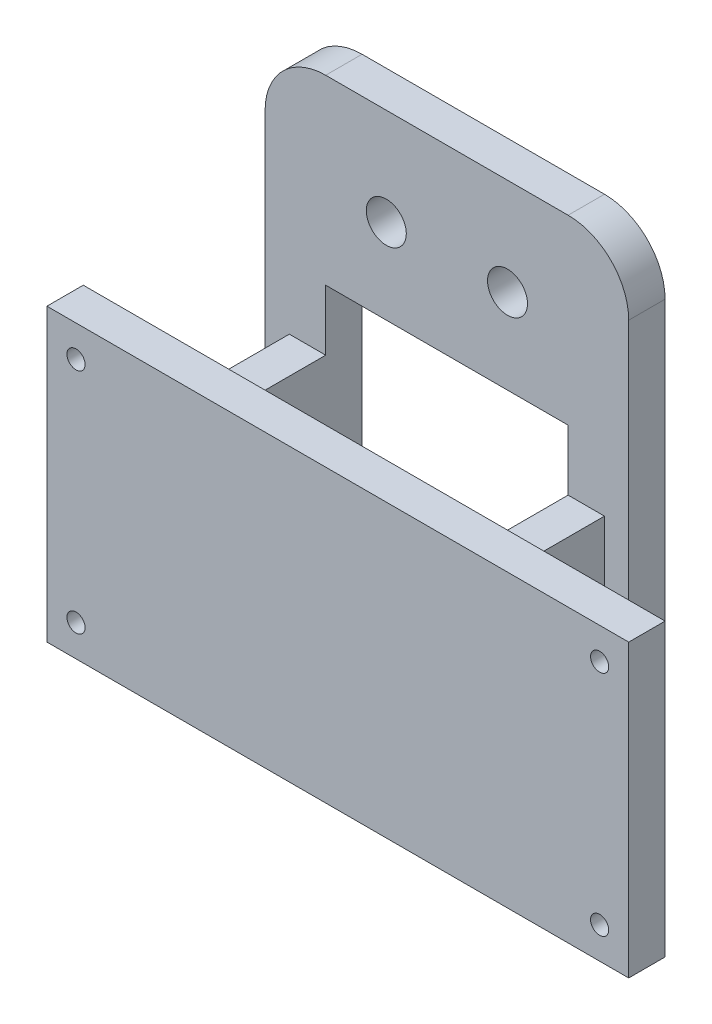
ISO-10303-21;
HEADER;
FILE_DESCRIPTION(('STEP AP214'),'2;1');
FILE_NAME('part.step','',(''),(''),'','','');
FILE_SCHEMA(('AUTOMOTIVE_DESIGN { 1 0 10303 214 1 1 1 1 }'));
ENDSEC;
DATA;
#1=APPLICATION_CONTEXT('core data for automotive mechanical design processes');
#2=APPLICATION_PROTOCOL_DEFINITION('international standard','automotive_design',2000,#1);
#3=PRODUCT_CONTEXT('',#1,'mechanical');
#4=PRODUCT('Part','Part','',(#3));
#5=PRODUCT_RELATED_PRODUCT_CATEGORY('part','',(#4));
#6=PRODUCT_DEFINITION_FORMATION('','',#4);
#7=PRODUCT_DEFINITION_CONTEXT('part definition',#1,'design');
#8=PRODUCT_DEFINITION('design','',#6,#7);
#9=PRODUCT_DEFINITION_SHAPE('','',#8);
#10=(LENGTH_UNIT() NAMED_UNIT(*) SI_UNIT(.MILLI.,.METRE.));
#11=(NAMED_UNIT(*) PLANE_ANGLE_UNIT() SI_UNIT($,.RADIAN.));
#12=(NAMED_UNIT(*) SI_UNIT($,.STERADIAN.) SOLID_ANGLE_UNIT());
#13=UNCERTAINTY_MEASURE_WITH_UNIT(LENGTH_MEASURE(1.E-05),#10,'distance_accuracy_value','');
#14=(GEOMETRIC_REPRESENTATION_CONTEXT(3) GLOBAL_UNCERTAINTY_ASSIGNED_CONTEXT((#13)) GLOBAL_UNIT_ASSIGNED_CONTEXT((#10,
#11,#12)) REPRESENTATION_CONTEXT('',''));
#15=CARTESIAN_POINT('',(0.,0.,0.));
#16=DIRECTION('',(0.,0.,1.));
#17=DIRECTION('',(1.,0.,0.));
#18=AXIS2_PLACEMENT_3D('',#15,#16,#17);
#19=CARTESIAN_POINT('',(-9.18461538461539,-30.6461538461539,3.));
#20=DIRECTION('',(0.,1.,0.));
#21=DIRECTION('',(0.,0.,1.));
#22=AXIS2_PLACEMENT_3D('',#19,#20,#21);
#23=PLANE('',#22);
#24=DIRECTION('',(1.,0.,0.));
#25=VECTOR('',#24,1.);
#26=CARTESIAN_POINT('',(-9.18461538461539,-30.6461538461539,0.));
#27=LINE('',#26,#25);
#28=CARTESIAN_POINT('',(-9.18461538461539,-30.6461538461539,0.));
#29=VERTEX_POINT('',#28);
#30=CARTESIAN_POINT('',(-4.18461538461539,-30.6461538461539,0.));
#31=VERTEX_POINT('',#30);
#32=EDGE_CURVE('E317',#29,#31,#27,.T.);
#33=ORIENTED_EDGE('',*,*,#32,.T.);
#34=DIRECTION('',(0.,0.,1.));
#35=VECTOR('',#34,1.);
#36=CARTESIAN_POINT('',(-4.18461538461539,-30.6461538461539,3.));
#37=LINE('',#36,#35);
#38=CARTESIAN_POINT('',(-4.18461538461539,-30.6461538461539,9.));
#39=VERTEX_POINT('',#38);
#40=EDGE_CURVE('E47',#31,#39,#37,.T.);
#41=ORIENTED_EDGE('',*,*,#40,.T.);
#42=DIRECTION('',(1.,0.,0.));
#43=VECTOR('',#42,1.);
#44=CARTESIAN_POINT('',(-4.18461538461539,-30.6461538461539,9.));
#45=LINE('',#44,#43);
#46=CARTESIAN_POINT('',(-7.18461538461539,-30.6461538461539,9.));
#47=VERTEX_POINT('',#46);
#48=EDGE_CURVE('E219',#47,#39,#45,.T.);
#49=ORIENTED_EDGE('',*,*,#48,.F.);
#50=DIRECTION('',(0.,0.,-1.));
#51=VECTOR('',#50,1.);
#52=CARTESIAN_POINT('',(-7.18461538461539,-30.6461538461539,9.));
#53=LINE('',#52,#51);
#54=CARTESIAN_POINT('',(-7.18461538461539,-30.6461538461539,3.));
#55=VERTEX_POINT('',#54);
#56=EDGE_CURVE('E222',#47,#55,#53,.T.);
#57=ORIENTED_EDGE('',*,*,#56,.T.);
#58=DIRECTION('',(1.,0.,0.));
#59=VECTOR('',#58,1.);
#60=CARTESIAN_POINT('',(-9.18461538461539,-30.6461538461539,3.));
#61=LINE('',#60,#59);
#62=CARTESIAN_POINT('',(-9.18461538461539,-30.6461538461539,3.));
#63=VERTEX_POINT('',#62);
#64=EDGE_CURVE('E306',#63,#55,#61,.T.);
#65=ORIENTED_EDGE('',*,*,#64,.F.);
#66=DIRECTION('',(0.,0.,-1.));
#67=VECTOR('',#66,1.);
#68=CARTESIAN_POINT('',(-9.18461538461539,-30.6461538461539,3.));
#69=LINE('',#68,#67);
#70=EDGE_CURVE('E327',#63,#29,#69,.T.);
#71=ORIENTED_EDGE('',*,*,#70,.T.);
#72=EDGE_LOOP('',(#33,#41,#49,#57,#65,#71));
#73=FACE_BOUND('',#72,.T.);
#74=ADVANCED_FACE('F39',(#73),#23,.F.);
#75=CARTESIAN_POINT('',(20.8153846153846,4.35384615384615,3.));
#76=DIRECTION('',(-1.,0.,0.));
#77=DIRECTION('',(0.,-1.,0.));
#78=AXIS2_PLACEMENT_3D('',#75,#76,#77);
#79=PLANE('',#78);
#80=DIRECTION('',(0.,0.,1.));
#81=VECTOR('',#80,1.);
#82=CARTESIAN_POINT('',(20.8153846153846,-0.646153846153847,-3.));
#83=LINE('',#82,#81);
#84=CARTESIAN_POINT('',(20.8153846153846,-0.646153846153847,0.));
#85=VERTEX_POINT('',#84);
#86=CARTESIAN_POINT('',(20.8153846153846,-0.646153846153847,3.));
#87=VERTEX_POINT('',#86);
#88=EDGE_CURVE('E235',#85,#87,#83,.T.);
#89=ORIENTED_EDGE('',*,*,#88,.T.);
#90=DIRECTION('',(0.,1.,0.));
#91=VECTOR('',#90,1.);
#92=CARTESIAN_POINT('',(20.8153846153846,4.35384615384615,3.));
#93=LINE('',#92,#91);
#94=CARTESIAN_POINT('',(20.8153846153846,-30.6461538461539,3.));
#95=VERTEX_POINT('',#94);
#96=EDGE_CURVE('E308',#95,#87,#93,.T.);
#97=ORIENTED_EDGE('',*,*,#96,.F.);
#98=DIRECTION('',(0.,0.,-1.));
#99=VECTOR('',#98,1.);
#100=CARTESIAN_POINT('',(20.8153846153846,-30.6461538461539,3.));
#101=LINE('',#100,#99);
#102=CARTESIAN_POINT('',(20.8153846153846,-30.6461538461539,0.));
#103=VERTEX_POINT('',#102);
#104=EDGE_CURVE('E314',#95,#103,#101,.T.);
#105=ORIENTED_EDGE('',*,*,#104,.T.);
#106=DIRECTION('',(0.,1.,0.));
#107=VECTOR('',#106,1.);
#108=CARTESIAN_POINT('',(20.8153846153846,4.35384615384615,0.));
#109=LINE('',#108,#107);
#110=EDGE_CURVE('E320',#103,#85,#109,.T.);
#111=ORIENTED_EDGE('',*,*,#110,.T.);
#112=EDGE_LOOP('',(#89,#97,#105,#111));
#113=FACE_BOUND('',#112,.T.);
#114=ADVANCED_FACE('F382',(#113),#79,.F.);
#115=CARTESIAN_POINT('',(-9.18461538461539,4.35384615384615,3.));
#116=DIRECTION('',(0.,-1.,0.));
#117=DIRECTION('',(0.,0.,-1.));
#118=AXIS2_PLACEMENT_3D('',#115,#116,#117);
#119=PLANE('',#118);
#120=DIRECTION('',(-1.,0.,0.));
#121=VECTOR('',#120,1.);
#122=CARTESIAN_POINT('',(-9.18461538461539,4.35384615384615,3.));
#123=LINE('',#122,#121);
#124=CARTESIAN_POINT('',(15.8153846153846,4.35384615384615,3.));
#125=VERTEX_POINT('',#124);
#126=CARTESIAN_POINT('',(-4.18461538461539,4.35384615384615,3.));
#127=VERTEX_POINT('',#126);
#128=EDGE_CURVE('E311',#125,#127,#123,.T.);
#129=ORIENTED_EDGE('',*,*,#128,.F.);
#130=DIRECTION('',(0.,0.,1.));
#131=VECTOR('',#130,1.);
#132=CARTESIAN_POINT('',(15.8153846153846,4.35384615384615,-3.));
#133=LINE('',#132,#131);
#134=CARTESIAN_POINT('',(15.8153846153846,4.35384615384615,0.));
#135=VERTEX_POINT('',#134);
#136=EDGE_CURVE('E332',#125,#135,#133,.F.);
#137=ORIENTED_EDGE('',*,*,#136,.T.);
#138=DIRECTION('',(-1.,0.,0.));
#139=VECTOR('',#138,1.);
#140=CARTESIAN_POINT('',(-9.18461538461539,4.35384615384615,0.));
#141=LINE('',#140,#139);
#142=CARTESIAN_POINT('',(-4.18461538461539,4.35384615384615,0.));
#143=VERTEX_POINT('',#142);
#144=EDGE_CURVE('E305',#135,#143,#141,.T.);
#145=ORIENTED_EDGE('',*,*,#144,.T.);
#146=DIRECTION('',(0.,0.,1.));
#147=VECTOR('',#146,1.);
#148=CARTESIAN_POINT('',(-4.18461538461539,4.35384615384615,-3.));
#149=LINE('',#148,#147);
#150=EDGE_CURVE('E330',#127,#143,#149,.F.);
#151=ORIENTED_EDGE('',*,*,#150,.F.);
#152=EDGE_LOOP('',(#129,#137,#145,#151));
#153=FACE_BOUND('',#152,.T.);
#154=ADVANCED_FACE('F389',(#153),#119,.F.);
#155=CARTESIAN_POINT('',(0.,0.,3.));
#156=DIRECTION('',(0.,0.,1.));
#157=DIRECTION('',(1.,0.,0.));
#158=AXIS2_PLACEMENT_3D('',#155,#156,#157);
#159=PLANE('',#158);
#160=DIRECTION('',(0.,-1.,0.));
#161=VECTOR('',#160,1.);
#162=CARTESIAN_POINT('',(-7.18461538461539,-30.6461538461539,3.));
#163=LINE('',#162,#161);
#164=CARTESIAN_POINT('',(-7.18461538461539,-15.6461538461539,3.));
#165=VERTEX_POINT('',#164);
#166=EDGE_CURVE('E213',#165,#55,#163,.T.);
#167=ORIENTED_EDGE('',*,*,#166,.F.);
#168=DIRECTION('',(-1.,0.,0.));
#169=VECTOR('',#168,1.);
#170=CARTESIAN_POINT('',(-4.18461538461539,-15.6461538461539,3.));
#171=LINE('',#170,#169);
#172=CARTESIAN_POINT('',(-4.18461538461539,-15.6461538461539,3.));
#173=VERTEX_POINT('',#172);
#174=EDGE_CURVE('E223',#173,#165,#171,.T.);
#175=ORIENTED_EDGE('',*,*,#174,.F.);
#176=DIRECTION('',(0.,-1.,0.));
#177=VECTOR('',#176,1.);
#178=CARTESIAN_POINT('',(-4.18461538461539,-30.6461538461539,3.));
#179=LINE('',#178,#177);
#180=CARTESIAN_POINT('',(-4.18461538461539,-10.6461538461539,3.));
#181=VERTEX_POINT('',#180);
#182=EDGE_CURVE('E267',#181,#173,#179,.T.);
#183=ORIENTED_EDGE('',*,*,#182,.F.);
#184=DIRECTION('',(-1.,0.,0.));
#185=VECTOR('',#184,1.);
#186=CARTESIAN_POINT('',(-4.18461538461539,-10.6461538461539,3.));
#187=LINE('',#186,#185);
#188=CARTESIAN_POINT('',(15.8153846153846,-10.6461538461539,3.));
#189=VERTEX_POINT('',#188);
#190=EDGE_CURVE('E260',#189,#181,#187,.T.);
#191=ORIENTED_EDGE('',*,*,#190,.F.);
#192=DIRECTION('',(0.,1.,0.));
#193=VECTOR('',#192,1.);
#194=CARTESIAN_POINT('',(15.8153846153846,-30.6461538461539,3.));
#195=LINE('',#194,#193);
#196=CARTESIAN_POINT('',(15.8153846153846,-15.6461538461539,3.));
#197=VERTEX_POINT('',#196);
#198=EDGE_CURVE('E60',#197,#189,#195,.T.);
#199=ORIENTED_EDGE('',*,*,#198,.F.);
#200=DIRECTION('',(-1.,0.,0.));
#201=VECTOR('',#200,1.);
#202=CARTESIAN_POINT('',(15.8153846153846,-15.6461538461539,3.));
#203=LINE('',#202,#201);
#204=CARTESIAN_POINT('',(18.8153846153846,-15.6461538461539,3.));
#205=VERTEX_POINT('',#204);
#206=EDGE_CURVE('E243',#205,#197,#203,.T.);
#207=ORIENTED_EDGE('',*,*,#206,.F.);
#208=DIRECTION('',(0.,1.,0.));
#209=VECTOR('',#208,1.);
#210=CARTESIAN_POINT('',(18.8153846153846,-30.6461538461539,3.));
#211=LINE('',#210,#209);
#212=CARTESIAN_POINT('',(18.8153846153846,-30.6461538461539,3.));
#213=VERTEX_POINT('',#212);
#214=EDGE_CURVE('E54',#213,#205,#211,.T.);
#215=ORIENTED_EDGE('',*,*,#214,.F.);
#216=EDGE_CURVE('E304',#213,#95,#61,.T.);
#217=ORIENTED_EDGE('',*,*,#216,.T.);
#218=ORIENTED_EDGE('',*,*,#96,.T.);
#219=CARTESIAN_POINT('',(15.8153846153846,-0.646153846153846,3.));
#220=DIRECTION('',(0.,0.,-1.));
#221=DIRECTION('',(1.,0.,0.));
#222=AXIS2_PLACEMENT_3D('',#219,#220,#221);
#223=CIRCLE('',#222,5.);
#224=EDGE_CURVE('E263',#125,#87,#223,.T.);
#225=ORIENTED_EDGE('',*,*,#224,.F.);
#226=ORIENTED_EDGE('',*,*,#128,.T.);
#227=CARTESIAN_POINT('',(-4.18461538461539,-0.646153846153846,3.));
#228=DIRECTION('',(0.,0.,-1.));
#229=DIRECTION('',(-1.,0.,0.));
#230=AXIS2_PLACEMENT_3D('',#227,#228,#229);
#231=CIRCLE('',#230,5.);
#232=CARTESIAN_POINT('',(-9.18461538461539,-0.646153846153847,3.));
#233=VERTEX_POINT('',#232);
#234=EDGE_CURVE('E270',#233,#127,#231,.T.);
#235=ORIENTED_EDGE('',*,*,#234,.F.);
#236=DIRECTION('',(0.,-1.,0.));
#237=VECTOR('',#236,1.);
#238=CARTESIAN_POINT('',(-9.18461538461539,4.35384615384615,3.));
#239=LINE('',#238,#237);
#240=EDGE_CURVE('E302',#233,#63,#239,.T.);
#241=ORIENTED_EDGE('',*,*,#240,.T.);
#242=ORIENTED_EDGE('',*,*,#64,.T.);
#243=EDGE_LOOP('',(#167,#175,#183,#191,#199,#207,#215,#217,#218,#225,#226,#235,#241,#242));
#244=FACE_BOUND('',#243,.T.);
#245=CARTESIAN_POINT('',(0.815384615384613,-3.64615384615385,3.));
#246=DIRECTION('',(0.,0.,1.));
#247=DIRECTION('',(1.,0.,0.));
#248=AXIS2_PLACEMENT_3D('',#245,#246,#247);
#249=CIRCLE('',#248,1.65);
#250=CARTESIAN_POINT('',(2.46538461538461,-3.64615384615385,3.));
#251=VERTEX_POINT('',#250);
#252=EDGE_CURVE('E296',#251,#251,#249,.T.);
#253=ORIENTED_EDGE('',*,*,#252,.F.);
#254=EDGE_LOOP('',(#253));
#255=FACE_BOUND('',#254,.T.);
#256=CARTESIAN_POINT('',(10.8153846153846,-3.64615384615385,3.));
#257=DIRECTION('',(0.,0.,1.));
#258=DIRECTION('',(1.,0.,0.));
#259=AXIS2_PLACEMENT_3D('',#256,#257,#258);
#260=CIRCLE('',#259,1.65);
#261=CARTESIAN_POINT('',(12.4653846153846,-3.64615384615385,3.));
#262=VERTEX_POINT('',#261);
#263=EDGE_CURVE('E290',#262,#262,#260,.T.);
#264=ORIENTED_EDGE('',*,*,#263,.F.);
#265=EDGE_LOOP('',(#264));
#266=FACE_BOUND('',#265,.T.);
#267=ADVANCED_FACE('F364',(#244,#255,#266),#159,.T.);
#268=CARTESIAN_POINT('',(0.,0.,0.));
#269=DIRECTION('',(0.,0.,1.));
#270=DIRECTION('',(1.,0.,0.));
#271=AXIS2_PLACEMENT_3D('',#268,#269,#270);
#272=PLANE('',#271);
#273=ORIENTED_EDGE('',*,*,#144,.F.);
#274=CARTESIAN_POINT('',(15.8153846153846,-0.646153846153846,0.));
#275=DIRECTION('',(0.,0.,1.));
#276=DIRECTION('',(1.,0.,0.));
#277=AXIS2_PLACEMENT_3D('',#274,#275,#276);
#278=CIRCLE('',#277,5.);
#279=EDGE_CURVE('E280',#135,#85,#278,.F.);
#280=ORIENTED_EDGE('',*,*,#279,.T.);
#281=ORIENTED_EDGE('',*,*,#110,.F.);
#282=CARTESIAN_POINT('',(15.8153846153846,-30.6461538461539,0.));
#283=VERTEX_POINT('',#282);
#284=EDGE_CURVE('E316',#283,#103,#27,.T.);
#285=ORIENTED_EDGE('',*,*,#284,.F.);
#286=DIRECTION('',(0.,1.,0.));
#287=VECTOR('',#286,1.);
#288=CARTESIAN_POINT('',(15.8153846153846,0.,0.));
#289=LINE('',#288,#287);
#290=CARTESIAN_POINT('',(15.8153846153846,-10.6461538461539,0.));
#291=VERTEX_POINT('',#290);
#292=EDGE_CURVE('E283',#283,#291,#289,.T.);
#293=ORIENTED_EDGE('',*,*,#292,.T.);
#294=DIRECTION('',(-1.,0.,0.));
#295=VECTOR('',#294,1.);
#296=CARTESIAN_POINT('',(0.,-10.6461538461539,0.));
#297=LINE('',#296,#295);
#298=CARTESIAN_POINT('',(-4.18461538461539,-10.6461538461539,0.));
#299=VERTEX_POINT('',#298);
#300=EDGE_CURVE('E11',#291,#299,#297,.T.);
#301=ORIENTED_EDGE('',*,*,#300,.T.);
#302=DIRECTION('',(0.,-1.,0.));
#303=VECTOR('',#302,1.);
#304=CARTESIAN_POINT('',(-4.18461538461539,0.,0.));
#305=LINE('',#304,#303);
#306=EDGE_CURVE('E286',#299,#31,#305,.T.);
#307=ORIENTED_EDGE('',*,*,#306,.T.);
#308=ORIENTED_EDGE('',*,*,#32,.F.);
#309=DIRECTION('',(0.,-1.,0.));
#310=VECTOR('',#309,1.);
#311=CARTESIAN_POINT('',(-9.18461538461539,4.35384615384615,0.));
#312=LINE('',#311,#310);
#313=CARTESIAN_POINT('',(-9.18461538461539,-0.646153846153847,0.));
#314=VERTEX_POINT('',#313);
#315=EDGE_CURVE('E299',#314,#29,#312,.T.);
#316=ORIENTED_EDGE('',*,*,#315,.F.);
#317=CARTESIAN_POINT('',(-4.18461538461539,-0.646153846153846,0.));
#318=DIRECTION('',(0.,0.,1.));
#319=DIRECTION('',(1.,0.,0.));
#320=AXIS2_PLACEMENT_3D('',#317,#318,#319);
#321=CIRCLE('',#320,5.);
#322=EDGE_CURVE('E277',#314,#143,#321,.F.);
#323=ORIENTED_EDGE('',*,*,#322,.T.);
#324=EDGE_LOOP('',(#273,#280,#281,#285,#293,#301,#307,#308,#316,#323));
#325=FACE_BOUND('',#324,.T.);
#326=CARTESIAN_POINT('',(0.815384615384613,-3.64615384615385,0.));
#327=DIRECTION('',(0.,0.,1.));
#328=DIRECTION('',(1.,0.,0.));
#329=AXIS2_PLACEMENT_3D('',#326,#327,#328);
#330=CIRCLE('',#329,1.65);
#331=CARTESIAN_POINT('',(2.46538461538461,-3.64615384615385,0.));
#332=VERTEX_POINT('',#331);
#333=EDGE_CURVE('E293',#332,#332,#330,.T.);
#334=ORIENTED_EDGE('',*,*,#333,.T.);
#335=EDGE_LOOP('',(#334));
#336=FACE_BOUND('',#335,.T.);
#337=CARTESIAN_POINT('',(10.8153846153846,-3.64615384615385,0.));
#338=DIRECTION('',(0.,0.,1.));
#339=DIRECTION('',(1.,0.,0.));
#340=AXIS2_PLACEMENT_3D('',#337,#338,#339);
#341=CIRCLE('',#340,1.65);
#342=CARTESIAN_POINT('',(12.4653846153846,-3.64615384615385,0.));
#343=VERTEX_POINT('',#342);
#344=EDGE_CURVE('E289',#343,#343,#341,.T.);
#345=ORIENTED_EDGE('',*,*,#344,.T.);
#346=EDGE_LOOP('',(#345));
#347=FACE_BOUND('',#346,.T.);
#348=ADVANCED_FACE('F356',(#325,#336,#347),#272,.F.);
#349=CARTESIAN_POINT('',(-9.18461538461539,4.35384615384615,3.));
#350=DIRECTION('',(1.,0.,0.));
#351=DIRECTION('',(0.,1.,0.));
#352=AXIS2_PLACEMENT_3D('',#349,#350,#351);
#353=PLANE('',#352);
#354=ORIENTED_EDGE('',*,*,#240,.F.);
#355=DIRECTION('',(0.,0.,1.));
#356=VECTOR('',#355,1.);
#357=CARTESIAN_POINT('',(-9.18461538461539,-0.646153846153847,-3.));
#358=LINE('',#357,#356);
#359=EDGE_CURVE('E275',#314,#233,#358,.T.);
#360=ORIENTED_EDGE('',*,*,#359,.F.);
#361=ORIENTED_EDGE('',*,*,#315,.T.);
#362=ORIENTED_EDGE('',*,*,#70,.F.);
#363=EDGE_LOOP('',(#354,#360,#361,#362));
#364=FACE_BOUND('',#363,.T.);
#365=ADVANCED_FACE('F41',(#364),#353,.F.);
#366=ORIENTED_EDGE('',*,*,#216,.F.);
#367=DIRECTION('',(0.,0.,-1.));
#368=VECTOR('',#367,1.);
#369=CARTESIAN_POINT('',(18.8153846153846,-30.6461538461539,9.));
#370=LINE('',#369,#368);
#371=CARTESIAN_POINT('',(18.8153846153846,-30.6461538461539,9.));
#372=VERTEX_POINT('',#371);
#373=EDGE_CURVE('E200',#372,#213,#370,.T.);
#374=ORIENTED_EDGE('',*,*,#373,.F.);
#375=DIRECTION('',(1.,0.,0.));
#376=VECTOR('',#375,1.);
#377=CARTESIAN_POINT('',(15.8153846153846,-30.6461538461539,9.));
#378=LINE('',#377,#376);
#379=CARTESIAN_POINT('',(15.8153846153846,-30.6461538461539,9.));
#380=VERTEX_POINT('',#379);
#381=EDGE_CURVE('E252',#380,#372,#378,.T.);
#382=ORIENTED_EDGE('',*,*,#381,.F.);
#383=DIRECTION('',(0.,0.,-1.));
#384=VECTOR('',#383,1.);
#385=CARTESIAN_POINT('',(15.8153846153846,-30.6461538461539,3.));
#386=LINE('',#385,#384);
#387=EDGE_CURVE('E335',#380,#283,#386,.T.);
#388=ORIENTED_EDGE('',*,*,#387,.T.);
#389=ORIENTED_EDGE('',*,*,#284,.T.);
#390=ORIENTED_EDGE('',*,*,#104,.F.);
#391=EDGE_LOOP('',(#366,#374,#382,#388,#389,#390));
#392=FACE_BOUND('',#391,.T.);
#393=ADVANCED_FACE('F383',(#392),#23,.F.);
#394=CARTESIAN_POINT('',(0.815384615384613,-3.64615384615385,3.));
#395=DIRECTION('',(0.,0.,-1.));
#396=DIRECTION('',(-1.,0.,0.));
#397=AXIS2_PLACEMENT_3D('',#394,#395,#396);
#398=CYLINDRICAL_SURFACE('',#397,1.65);
#399=ORIENTED_EDGE('',*,*,#252,.T.);
#400=EDGE_LOOP('',(#399));
#401=FACE_BOUND('',#400,.T.);
#402=ORIENTED_EDGE('',*,*,#333,.F.);
#403=EDGE_LOOP('',(#402));
#404=FACE_BOUND('',#403,.T.);
#405=ADVANCED_FACE('F392',(#401,#404),#398,.F.);
#406=CARTESIAN_POINT('',(10.8153846153846,-3.64615384615385,3.));
#407=DIRECTION('',(0.,0.,-1.));
#408=DIRECTION('',(-1.,0.,0.));
#409=AXIS2_PLACEMENT_3D('',#406,#407,#408);
#410=CYLINDRICAL_SURFACE('',#409,1.65);
#411=ORIENTED_EDGE('',*,*,#263,.T.);
#412=EDGE_LOOP('',(#411));
#413=FACE_BOUND('',#412,.T.);
#414=ORIENTED_EDGE('',*,*,#344,.F.);
#415=EDGE_LOOP('',(#414));
#416=FACE_BOUND('',#415,.T.);
#417=ADVANCED_FACE('F398',(#413,#416),#410,.F.);
#418=CARTESIAN_POINT('',(-4.18461538461539,-0.646153846153846,-3.));
#419=DIRECTION('',(0.,0.,1.));
#420=DIRECTION('',(1.,0.,0.));
#421=AXIS2_PLACEMENT_3D('',#418,#419,#420);
#422=CYLINDRICAL_SURFACE('',#421,5.);
#423=ORIENTED_EDGE('',*,*,#359,.T.);
#424=ORIENTED_EDGE('',*,*,#234,.T.);
#425=ORIENTED_EDGE('',*,*,#150,.T.);
#426=ORIENTED_EDGE('',*,*,#322,.F.);
#427=EDGE_LOOP('',(#423,#424,#425,#426));
#428=FACE_BOUND('',#427,.T.);
#429=ADVANCED_FACE('F418',(#428),#422,.T.);
#430=CARTESIAN_POINT('',(15.8153846153846,-0.646153846153846,-3.));
#431=DIRECTION('',(0.,0.,1.));
#432=DIRECTION('',(1.,0.,0.));
#433=AXIS2_PLACEMENT_3D('',#430,#431,#432);
#434=CYLINDRICAL_SURFACE('',#433,5.);
#435=ORIENTED_EDGE('',*,*,#136,.F.);
#436=ORIENTED_EDGE('',*,*,#224,.T.);
#437=ORIENTED_EDGE('',*,*,#88,.F.);
#438=ORIENTED_EDGE('',*,*,#279,.F.);
#439=EDGE_LOOP('',(#435,#436,#437,#438));
#440=FACE_BOUND('',#439,.T.);
#441=ADVANCED_FACE('F420',(#440),#434,.T.);
#442=CARTESIAN_POINT('',(-4.18461538461539,-10.6461538461539,-3.));
#443=DIRECTION('',(0.,1.,0.));
#444=DIRECTION('',(0.,0.,1.));
#445=AXIS2_PLACEMENT_3D('',#442,#443,#444);
#446=PLANE('',#445);
#447=DIRECTION('',(0.,0.,1.));
#448=VECTOR('',#447,1.);
#449=CARTESIAN_POINT('',(15.8153846153846,-10.6461538461539,-3.));
#450=LINE('',#449,#448);
#451=EDGE_CURVE('E257',#291,#189,#450,.T.);
#452=ORIENTED_EDGE('',*,*,#451,.T.);
#453=ORIENTED_EDGE('',*,*,#190,.T.);
#454=DIRECTION('',(0.,0.,1.));
#455=VECTOR('',#454,1.);
#456=CARTESIAN_POINT('',(-4.18461538461539,-10.6461538461539,-3.));
#457=LINE('',#456,#455);
#458=EDGE_CURVE('E261',#299,#181,#457,.T.);
#459=ORIENTED_EDGE('',*,*,#458,.F.);
#460=ORIENTED_EDGE('',*,*,#300,.F.);
#461=EDGE_LOOP('',(#452,#453,#459,#460));
#462=FACE_BOUND('',#461,.T.);
#463=ADVANCED_FACE('F361',(#462),#446,.F.);
#464=CARTESIAN_POINT('',(-4.18461538461539,-30.6461538461539,-3.));
#465=DIRECTION('',(-1.,0.,0.));
#466=DIRECTION('',(0.,0.,1.));
#467=AXIS2_PLACEMENT_3D('',#464,#465,#466);
#468=PLANE('',#467);
#469=ORIENTED_EDGE('',*,*,#458,.T.);
#470=ORIENTED_EDGE('',*,*,#182,.T.);
#471=DIRECTION('',(0.,0.,-1.));
#472=VECTOR('',#471,1.);
#473=CARTESIAN_POINT('',(-4.18461538461539,-15.6461538461539,9.));
#474=LINE('',#473,#472);
#475=CARTESIAN_POINT('',(-4.18461538461539,-15.6461538461539,9.));
#476=VERTEX_POINT('',#475);
#477=EDGE_CURVE('E233',#476,#173,#474,.T.);
#478=ORIENTED_EDGE('',*,*,#477,.F.);
#479=DIRECTION('',(0.,1.,0.));
#480=VECTOR('',#479,1.);
#481=CARTESIAN_POINT('',(-4.18461538461539,-30.6461538461539,9.));
#482=LINE('',#481,#480);
#483=EDGE_CURVE('E209',#39,#476,#482,.T.);
#484=ORIENTED_EDGE('',*,*,#483,.F.);
#485=ORIENTED_EDGE('',*,*,#40,.F.);
#486=ORIENTED_EDGE('',*,*,#306,.F.);
#487=EDGE_LOOP('',(#469,#470,#478,#484,#485,#486));
#488=FACE_BOUND('',#487,.T.);
#489=ADVANCED_FACE('F359',(#488),#468,.F.);
#490=CARTESIAN_POINT('',(15.8153846153846,-30.6461538461539,-3.));
#491=DIRECTION('',(1.,0.,0.));
#492=DIRECTION('',(0.,0.,-1.));
#493=AXIS2_PLACEMENT_3D('',#490,#491,#492);
#494=PLANE('',#493);
#495=ORIENTED_EDGE('',*,*,#387,.F.);
#496=DIRECTION('',(0.,-1.,0.));
#497=VECTOR('',#496,1.);
#498=CARTESIAN_POINT('',(15.8153846153846,-30.6461538461539,9.));
#499=LINE('',#498,#497);
#500=CARTESIAN_POINT('',(15.8153846153846,-15.6461538461539,9.));
#501=VERTEX_POINT('',#500);
#502=EDGE_CURVE('E245',#501,#380,#499,.T.);
#503=ORIENTED_EDGE('',*,*,#502,.F.);
#504=DIRECTION('',(0.,0.,-1.));
#505=VECTOR('',#504,1.);
#506=CARTESIAN_POINT('',(15.8153846153846,-15.6461538461539,9.));
#507=LINE('',#506,#505);
#508=EDGE_CURVE('E239',#501,#197,#507,.T.);
#509=ORIENTED_EDGE('',*,*,#508,.T.);
#510=ORIENTED_EDGE('',*,*,#198,.T.);
#511=ORIENTED_EDGE('',*,*,#451,.F.);
#512=ORIENTED_EDGE('',*,*,#292,.F.);
#513=EDGE_LOOP('',(#495,#503,#509,#510,#511,#512));
#514=FACE_BOUND('',#513,.T.);
#515=ADVANCED_FACE('F506',(#514),#494,.F.);
#516=CARTESIAN_POINT('',(18.8153846153846,-30.6461538461539,9.));
#517=DIRECTION('',(-1.,0.,0.));
#518=DIRECTION('',(0.,0.,1.));
#519=AXIS2_PLACEMENT_3D('',#516,#517,#518);
#520=PLANE('',#519);
#521=ORIENTED_EDGE('',*,*,#214,.T.);
#522=DIRECTION('',(0.,0.,-1.));
#523=VECTOR('',#522,1.);
#524=CARTESIAN_POINT('',(18.8153846153846,-15.6461538461539,9.));
#525=LINE('',#524,#523);
#526=CARTESIAN_POINT('',(18.8153846153846,-15.6461538461539,9.));
#527=VERTEX_POINT('',#526);
#528=EDGE_CURVE('E203',#527,#205,#525,.T.);
#529=ORIENTED_EDGE('',*,*,#528,.F.);
#530=DIRECTION('',(0.,1.,0.));
#531=VECTOR('',#530,1.);
#532=CARTESIAN_POINT('',(18.8153846153846,-30.6461538461539,9.));
#533=LINE('',#532,#531);
#534=EDGE_CURVE('E249',#372,#527,#533,.T.);
#535=ORIENTED_EDGE('',*,*,#534,.F.);
#536=ORIENTED_EDGE('',*,*,#373,.T.);
#537=EDGE_LOOP('',(#521,#529,#535,#536));
#538=FACE_BOUND('',#537,.T.);
#539=ADVANCED_FACE('F377',(#538),#520,.F.);
#540=CARTESIAN_POINT('',(15.8153846153846,-15.6461538461539,9.));
#541=DIRECTION('',(0.,-1.,0.));
#542=DIRECTION('',(0.,0.,-1.));
#543=AXIS2_PLACEMENT_3D('',#540,#541,#542);
#544=PLANE('',#543);
#545=ORIENTED_EDGE('',*,*,#206,.T.);
#546=ORIENTED_EDGE('',*,*,#508,.F.);
#547=DIRECTION('',(-1.,0.,0.));
#548=VECTOR('',#547,1.);
#549=CARTESIAN_POINT('',(15.8153846153846,-15.6461538461539,9.));
#550=LINE('',#549,#548);
#551=EDGE_CURVE('E242',#527,#501,#550,.T.);
#552=ORIENTED_EDGE('',*,*,#551,.F.);
#553=ORIENTED_EDGE('',*,*,#528,.T.);
#554=EDGE_LOOP('',(#545,#546,#552,#553));
#555=FACE_BOUND('',#554,.T.);
#556=ADVANCED_FACE('F370',(#555),#544,.F.);
#557=CARTESIAN_POINT('',(-4.18461538461539,-15.6461538461539,9.));
#558=DIRECTION('',(0.,-1.,0.));
#559=DIRECTION('',(0.,0.,-1.));
#560=AXIS2_PLACEMENT_3D('',#557,#558,#559);
#561=PLANE('',#560);
#562=ORIENTED_EDGE('',*,*,#174,.T.);
#563=DIRECTION('',(0.,0.,-1.));
#564=VECTOR('',#563,1.);
#565=CARTESIAN_POINT('',(-7.18461538461539,-15.6461538461539,9.));
#566=LINE('',#565,#564);
#567=CARTESIAN_POINT('',(-7.18461538461539,-15.6461538461539,9.));
#568=VERTEX_POINT('',#567);
#569=EDGE_CURVE('E230',#568,#165,#566,.T.);
#570=ORIENTED_EDGE('',*,*,#569,.F.);
#571=DIRECTION('',(-1.,0.,0.));
#572=VECTOR('',#571,1.);
#573=CARTESIAN_POINT('',(-4.18461538461539,-15.6461538461539,9.));
#574=LINE('',#573,#572);
#575=EDGE_CURVE('E212',#476,#568,#574,.T.);
#576=ORIENTED_EDGE('',*,*,#575,.F.);
#577=ORIENTED_EDGE('',*,*,#477,.T.);
#578=EDGE_LOOP('',(#562,#570,#576,#577));
#579=FACE_BOUND('',#578,.T.);
#580=ADVANCED_FACE('F368',(#579),#561,.F.);
#581=CARTESIAN_POINT('',(-7.18461538461539,-30.6461538461539,9.));
#582=DIRECTION('',(1.,0.,0.));
#583=DIRECTION('',(0.,0.,-1.));
#584=AXIS2_PLACEMENT_3D('',#581,#582,#583);
#585=PLANE('',#584);
#586=ORIENTED_EDGE('',*,*,#166,.T.);
#587=ORIENTED_EDGE('',*,*,#56,.F.);
#588=DIRECTION('',(0.,-1.,0.));
#589=VECTOR('',#588,1.);
#590=CARTESIAN_POINT('',(-7.18461538461539,-30.6461538461539,9.));
#591=LINE('',#590,#589);
#592=EDGE_CURVE('E216',#568,#47,#591,.T.);
#593=ORIENTED_EDGE('',*,*,#592,.F.);
#594=ORIENTED_EDGE('',*,*,#569,.T.);
#595=EDGE_LOOP('',(#586,#587,#593,#594));
#596=FACE_BOUND('',#595,.T.);
#597=ADVANCED_FACE('F347',(#596),#585,.F.);
#598=CARTESIAN_POINT('',(0.,0.,9.));
#599=DIRECTION('',(0.,0.,1.));
#600=DIRECTION('',(1.,0.,0.));
#601=AXIS2_PLACEMENT_3D('',#598,#599,#600);
#602=PLANE('',#601);
#603=CARTESIAN_POINT('',(27.4153846153846,-17.2461538461538,9.));
#604=DIRECTION('',(0.,0.,1.));
#605=DIRECTION('',(1.,0.,0.));
#606=AXIS2_PLACEMENT_3D('',#603,#604,#605);
#607=CIRCLE('',#606,0.750000000000002);
#608=CARTESIAN_POINT('',(28.1653846153846,-17.2461538461538,9.));
#609=VERTEX_POINT('',#608);
#610=EDGE_CURVE('E646',#609,#609,#607,.T.);
#611=ORIENTED_EDGE('',*,*,#610,.T.);
#612=EDGE_LOOP('',(#611));
#613=FACE_BOUND('',#612,.T.);
#614=CARTESIAN_POINT('',(27.4153846153846,-36.0461538461538,9.));
#615=DIRECTION('',(0.,0.,1.));
#616=DIRECTION('',(1.,0.,0.));
#617=AXIS2_PLACEMENT_3D('',#614,#615,#616);
#618=CIRCLE('',#617,0.750000000000002);
#619=CARTESIAN_POINT('',(28.1653846153846,-36.0461538461538,9.));
#620=VERTEX_POINT('',#619);
#621=EDGE_CURVE('E647',#620,#620,#618,.T.);
#622=ORIENTED_EDGE('',*,*,#621,.T.);
#623=EDGE_LOOP('',(#622));
#624=FACE_BOUND('',#623,.T.);
#625=CARTESIAN_POINT('',(-15.7846153846154,-36.0461538461538,9.));
#626=DIRECTION('',(0.,0.,1.));
#627=DIRECTION('',(1.,0.,0.));
#628=AXIS2_PLACEMENT_3D('',#625,#626,#627);
#629=CIRCLE('',#628,0.750000000000002);
#630=CARTESIAN_POINT('',(-15.0346153846154,-36.0461538461538,9.));
#631=VERTEX_POINT('',#630);
#632=EDGE_CURVE('E652',#631,#631,#629,.T.);
#633=ORIENTED_EDGE('',*,*,#632,.T.);
#634=EDGE_LOOP('',(#633));
#635=FACE_BOUND('',#634,.T.);
#636=CARTESIAN_POINT('',(-15.7846153846154,-17.2461538461538,9.));
#637=DIRECTION('',(0.,0.,1.));
#638=DIRECTION('',(1.,0.,0.));
#639=AXIS2_PLACEMENT_3D('',#636,#637,#638);
#640=CIRCLE('',#639,0.750000000000002);
#641=CARTESIAN_POINT('',(-15.0346153846154,-17.2461538461538,9.));
#642=VERTEX_POINT('',#641);
#643=EDGE_CURVE('E670',#642,#642,#640,.T.);
#644=ORIENTED_EDGE('',*,*,#643,.T.);
#645=EDGE_LOOP('',(#644));
#646=FACE_BOUND('',#645,.T.);
#647=DIRECTION('',(0.,-1.,0.));
#648=VECTOR('',#647,1.);
#649=CARTESIAN_POINT('',(-18.1846153846154,-14.6461538461539,9.));
#650=LINE('',#649,#648);
#651=CARTESIAN_POINT('',(-18.1846153846154,-14.6461538461539,9.));
#652=VERTEX_POINT('',#651);
#653=CARTESIAN_POINT('',(-18.1846153846154,-38.6461538461539,9.));
#654=VERTEX_POINT('',#653);
#655=EDGE_CURVE('E199',#652,#654,#650,.T.);
#656=ORIENTED_EDGE('',*,*,#655,.F.);
#657=DIRECTION('',(-1.,0.,0.));
#658=VECTOR('',#657,1.);
#659=CARTESIAN_POINT('',(-18.1846153846154,-14.6461538461539,9.));
#660=LINE('',#659,#658);
#661=CARTESIAN_POINT('',(29.8153846153846,-14.6461538461539,9.));
#662=VERTEX_POINT('',#661);
#663=EDGE_CURVE('E195',#662,#652,#660,.T.);
#664=ORIENTED_EDGE('',*,*,#663,.F.);
#665=DIRECTION('',(0.,1.,0.));
#666=VECTOR('',#665,1.);
#667=CARTESIAN_POINT('',(29.8153846153846,-14.6461538461539,9.));
#668=LINE('',#667,#666);
#669=CARTESIAN_POINT('',(29.8153846153846,-38.6461538461539,9.));
#670=VERTEX_POINT('',#669);
#671=EDGE_CURVE('E660',#670,#662,#668,.T.);
#672=ORIENTED_EDGE('',*,*,#671,.F.);
#673=DIRECTION('',(1.,0.,0.));
#674=VECTOR('',#673,1.);
#675=CARTESIAN_POINT('',(-18.1846153846154,-38.6461538461539,9.));
#676=LINE('',#675,#674);
#677=EDGE_CURVE('E649',#654,#670,#676,.T.);
#678=ORIENTED_EDGE('',*,*,#677,.F.);
#679=EDGE_LOOP('',(#656,#664,#672,#678));
#680=FACE_BOUND('',#679,.T.);
#681=ORIENTED_EDGE('',*,*,#48,.T.);
#682=ORIENTED_EDGE('',*,*,#483,.T.);
#683=ORIENTED_EDGE('',*,*,#575,.T.);
#684=ORIENTED_EDGE('',*,*,#592,.T.);
#685=EDGE_LOOP('',(#681,#682,#683,#684));
#686=FACE_BOUND('',#685,.T.);
#687=ORIENTED_EDGE('',*,*,#551,.T.);
#688=ORIENTED_EDGE('',*,*,#502,.T.);
#689=ORIENTED_EDGE('',*,*,#381,.T.);
#690=ORIENTED_EDGE('',*,*,#534,.T.);
#691=EDGE_LOOP('',(#687,#688,#689,#690));
#692=FACE_BOUND('',#691,.T.);
#693=ADVANCED_FACE('F343',(#613,#624,#635,#646,#680,#686,#692),#602,.F.);
#694=CARTESIAN_POINT('',(-18.1846153846154,-14.6461538461539,12.));
#695=DIRECTION('',(1.,0.,0.));
#696=DIRECTION('',(0.,1.,0.));
#697=AXIS2_PLACEMENT_3D('',#694,#695,#696);
#698=PLANE('',#697);
#699=ORIENTED_EDGE('',*,*,#655,.T.);
#700=DIRECTION('',(0.,0.,-1.));
#701=VECTOR('',#700,1.);
#702=CARTESIAN_POINT('',(-18.1846153846154,-38.6461538461539,12.));
#703=LINE('',#702,#701);
#704=CARTESIAN_POINT('',(-18.1846153846154,-38.6461538461539,12.));
#705=VERTEX_POINT('',#704);
#706=EDGE_CURVE('E179',#705,#654,#703,.T.);
#707=ORIENTED_EDGE('',*,*,#706,.F.);
#708=DIRECTION('',(0.,-1.,0.));
#709=VECTOR('',#708,1.);
#710=CARTESIAN_POINT('',(-18.1846153846154,-14.6461538461539,12.));
#711=LINE('',#710,#709);
#712=CARTESIAN_POINT('',(-18.1846153846154,-14.6461538461539,12.));
#713=VERTEX_POINT('',#712);
#714=EDGE_CURVE('E186',#713,#705,#711,.T.);
#715=ORIENTED_EDGE('',*,*,#714,.F.);
#716=DIRECTION('',(0.,0.,-1.));
#717=VECTOR('',#716,1.);
#718=CARTESIAN_POINT('',(-18.1846153846154,-14.6461538461539,12.));
#719=LINE('',#718,#717);
#720=EDGE_CURVE('E657',#713,#652,#719,.T.);
#721=ORIENTED_EDGE('',*,*,#720,.T.);
#722=EDGE_LOOP('',(#699,#707,#715,#721));
#723=FACE_BOUND('',#722,.T.);
#724=ADVANCED_FACE('F197',(#723),#698,.F.);
#725=CARTESIAN_POINT('',(-18.1846153846154,-38.6461538461539,12.));
#726=DIRECTION('',(0.,1.,0.));
#727=DIRECTION('',(0.,0.,1.));
#728=AXIS2_PLACEMENT_3D('',#725,#726,#727);
#729=PLANE('',#728);
#730=ORIENTED_EDGE('',*,*,#677,.T.);
#731=DIRECTION('',(0.,0.,-1.));
#732=VECTOR('',#731,1.);
#733=CARTESIAN_POINT('',(29.8153846153846,-38.6461538461539,12.));
#734=LINE('',#733,#732);
#735=CARTESIAN_POINT('',(29.8153846153846,-38.6461538461539,12.));
#736=VERTEX_POINT('',#735);
#737=EDGE_CURVE('E182',#736,#670,#734,.T.);
#738=ORIENTED_EDGE('',*,*,#737,.F.);
#739=DIRECTION('',(1.,0.,0.));
#740=VECTOR('',#739,1.);
#741=CARTESIAN_POINT('',(-18.1846153846154,-38.6461538461539,12.));
#742=LINE('',#741,#740);
#743=EDGE_CURVE('E175',#705,#736,#742,.T.);
#744=ORIENTED_EDGE('',*,*,#743,.F.);
#745=ORIENTED_EDGE('',*,*,#706,.T.);
#746=EDGE_LOOP('',(#730,#738,#744,#745));
#747=FACE_BOUND('',#746,.T.);
#748=ADVANCED_FACE('F177',(#747),#729,.F.);
#749=CARTESIAN_POINT('',(29.8153846153846,-14.6461538461539,12.));
#750=DIRECTION('',(-1.,0.,0.));
#751=DIRECTION('',(0.,0.,1.));
#752=AXIS2_PLACEMENT_3D('',#749,#750,#751);
#753=PLANE('',#752);
#754=ORIENTED_EDGE('',*,*,#671,.T.);
#755=DIRECTION('',(0.,0.,-1.));
#756=VECTOR('',#755,1.);
#757=CARTESIAN_POINT('',(29.8153846153846,-14.6461538461539,12.));
#758=LINE('',#757,#756);
#759=CARTESIAN_POINT('',(29.8153846153846,-14.6461538461539,12.));
#760=VERTEX_POINT('',#759);
#761=EDGE_CURVE('E205',#760,#662,#758,.T.);
#762=ORIENTED_EDGE('',*,*,#761,.F.);
#763=DIRECTION('',(0.,1.,0.));
#764=VECTOR('',#763,1.);
#765=CARTESIAN_POINT('',(29.8153846153846,-14.6461538461539,12.));
#766=LINE('',#765,#764);
#767=EDGE_CURVE('E185',#736,#760,#766,.T.);
#768=ORIENTED_EDGE('',*,*,#767,.F.);
#769=ORIENTED_EDGE('',*,*,#737,.T.);
#770=EDGE_LOOP('',(#754,#762,#768,#769));
#771=FACE_BOUND('',#770,.T.);
#772=ADVANCED_FACE('F571',(#771),#753,.F.);
#773=CARTESIAN_POINT('',(-18.1846153846154,-14.6461538461539,12.));
#774=DIRECTION('',(0.,-1.,0.));
#775=DIRECTION('',(0.,0.,-1.));
#776=AXIS2_PLACEMENT_3D('',#773,#774,#775);
#777=PLANE('',#776);
#778=ORIENTED_EDGE('',*,*,#663,.T.);
#779=ORIENTED_EDGE('',*,*,#720,.F.);
#780=DIRECTION('',(-1.,0.,0.));
#781=VECTOR('',#780,1.);
#782=CARTESIAN_POINT('',(-18.1846153846154,-14.6461538461539,12.));
#783=LINE('',#782,#781);
#784=EDGE_CURVE('E191',#760,#713,#783,.T.);
#785=ORIENTED_EDGE('',*,*,#784,.F.);
#786=ORIENTED_EDGE('',*,*,#761,.T.);
#787=EDGE_LOOP('',(#778,#779,#785,#786));
#788=FACE_BOUND('',#787,.T.);
#789=ADVANCED_FACE('F580',(#788),#777,.F.);
#790=CARTESIAN_POINT('',(0.,0.,12.));
#791=DIRECTION('',(0.,0.,1.));
#792=DIRECTION('',(1.,0.,0.));
#793=AXIS2_PLACEMENT_3D('',#790,#791,#792);
#794=PLANE('',#793);
#795=CARTESIAN_POINT('',(27.4153846153846,-17.2461538461538,12.));
#796=DIRECTION('',(0.,0.,1.));
#797=DIRECTION('',(-1.,0.,0.));
#798=AXIS2_PLACEMENT_3D('',#795,#796,#797);
#799=CIRCLE('',#798,0.750000000000002);
#800=CARTESIAN_POINT('',(26.6653846153846,-17.2461538461538,12.));
#801=VERTEX_POINT('',#800);
#802=EDGE_CURVE('E643',#801,#801,#799,.T.);
#803=ORIENTED_EDGE('',*,*,#802,.F.);
#804=EDGE_LOOP('',(#803));
#805=FACE_BOUND('',#804,.T.);
#806=CARTESIAN_POINT('',(27.4153846153846,-36.0461538461538,12.));
#807=DIRECTION('',(0.,0.,1.));
#808=DIRECTION('',(-1.,0.,0.));
#809=AXIS2_PLACEMENT_3D('',#806,#807,#808);
#810=CIRCLE('',#809,0.750000000000002);
#811=CARTESIAN_POINT('',(26.6653846153846,-36.0461538461538,12.));
#812=VERTEX_POINT('',#811);
#813=EDGE_CURVE('E678',#812,#812,#810,.T.);
#814=ORIENTED_EDGE('',*,*,#813,.F.);
#815=EDGE_LOOP('',(#814));
#816=FACE_BOUND('',#815,.T.);
#817=CARTESIAN_POINT('',(-15.7846153846154,-36.0461538461538,12.));
#818=DIRECTION('',(0.,0.,1.));
#819=DIRECTION('',(1.,0.,0.));
#820=AXIS2_PLACEMENT_3D('',#817,#818,#819);
#821=CIRCLE('',#820,0.750000000000002);
#822=CARTESIAN_POINT('',(-15.0346153846154,-36.0461538461538,12.));
#823=VERTEX_POINT('',#822);
#824=EDGE_CURVE('E676',#823,#823,#821,.T.);
#825=ORIENTED_EDGE('',*,*,#824,.F.);
#826=EDGE_LOOP('',(#825));
#827=FACE_BOUND('',#826,.T.);
#828=CARTESIAN_POINT('',(-15.7846153846154,-17.2461538461538,12.));
#829=DIRECTION('',(0.,0.,1.));
#830=DIRECTION('',(1.,0.,0.));
#831=AXIS2_PLACEMENT_3D('',#828,#829,#830);
#832=CIRCLE('',#831,0.750000000000002);
#833=CARTESIAN_POINT('',(-15.0346153846154,-17.2461538461538,12.));
#834=VERTEX_POINT('',#833);
#835=EDGE_CURVE('E673',#834,#834,#832,.T.);
#836=ORIENTED_EDGE('',*,*,#835,.F.);
#837=EDGE_LOOP('',(#836));
#838=FACE_BOUND('',#837,.T.);
#839=ORIENTED_EDGE('',*,*,#714,.T.);
#840=ORIENTED_EDGE('',*,*,#743,.T.);
#841=ORIENTED_EDGE('',*,*,#767,.T.);
#842=ORIENTED_EDGE('',*,*,#784,.T.);
#843=EDGE_LOOP('',(#839,#840,#841,#842));
#844=FACE_BOUND('',#843,.T.);
#845=ADVANCED_FACE('F189',(#805,#816,#827,#838,#844),#794,.T.);
#846=CARTESIAN_POINT('',(-15.7846153846154,-17.2461538461538,7.));
#847=DIRECTION('',(0.,0.,1.));
#848=DIRECTION('',(1.,0.,0.));
#849=AXIS2_PLACEMENT_3D('',#846,#847,#848);
#850=CYLINDRICAL_SURFACE('',#849,0.750000000000002);
#851=ORIENTED_EDGE('',*,*,#835,.T.);
#852=EDGE_LOOP('',(#851));
#853=FACE_BOUND('',#852,.T.);
#854=ORIENTED_EDGE('',*,*,#643,.F.);
#855=EDGE_LOOP('',(#854));
#856=FACE_BOUND('',#855,.T.);
#857=ADVANCED_FACE('F597',(#853,#856),#850,.F.);
#858=CARTESIAN_POINT('',(-15.7846153846154,-36.0461538461538,7.));
#859=DIRECTION('',(0.,0.,1.));
#860=DIRECTION('',(1.,0.,0.));
#861=AXIS2_PLACEMENT_3D('',#858,#859,#860);
#862=CYLINDRICAL_SURFACE('',#861,0.750000000000002);
#863=ORIENTED_EDGE('',*,*,#824,.T.);
#864=EDGE_LOOP('',(#863));
#865=FACE_BOUND('',#864,.T.);
#866=ORIENTED_EDGE('',*,*,#632,.F.);
#867=EDGE_LOOP('',(#866));
#868=FACE_BOUND('',#867,.T.);
#869=ADVANCED_FACE('F607',(#865,#868),#862,.F.);
#870=CARTESIAN_POINT('',(27.4153846153846,-36.0461538461538,7.));
#871=DIRECTION('',(0.,0.,1.));
#872=DIRECTION('',(1.,0.,0.));
#873=AXIS2_PLACEMENT_3D('',#870,#871,#872);
#874=CYLINDRICAL_SURFACE('',#873,0.750000000000002);
#875=ORIENTED_EDGE('',*,*,#813,.T.);
#876=EDGE_LOOP('',(#875));
#877=FACE_BOUND('',#876,.T.);
#878=ORIENTED_EDGE('',*,*,#621,.F.);
#879=EDGE_LOOP('',(#878));
#880=FACE_BOUND('',#879,.T.);
#881=ADVANCED_FACE('F617',(#877,#880),#874,.F.);
#882=CARTESIAN_POINT('',(27.4153846153846,-17.2461538461538,7.));
#883=DIRECTION('',(0.,0.,1.));
#884=DIRECTION('',(1.,0.,0.));
#885=AXIS2_PLACEMENT_3D('',#882,#883,#884);
#886=CYLINDRICAL_SURFACE('',#885,0.750000000000002);
#887=ORIENTED_EDGE('',*,*,#802,.T.);
#888=EDGE_LOOP('',(#887));
#889=FACE_BOUND('',#888,.T.);
#890=ORIENTED_EDGE('',*,*,#610,.F.);
#891=EDGE_LOOP('',(#890));
#892=FACE_BOUND('',#891,.T.);
#893=ADVANCED_FACE('F627',(#889,#892),#886,.F.);
#894=CLOSED_SHELL('',(#74,#114,#154,#267,#348,#365,#393,#405,#417,#429,#441,#463,#489,#515,#539,
#556,#580,#597,#693,#724,#748,#772,#789,#845,#857,#869,#881,#893));
#895=MANIFOLD_SOLID_BREP('B2',#894);
#896=ADVANCED_BREP_SHAPE_REPRESENTATION('',(#18,#895),#14);
#897=SHAPE_DEFINITION_REPRESENTATION(#9,#896);
ENDSEC;
END-ISO-10303-21;
